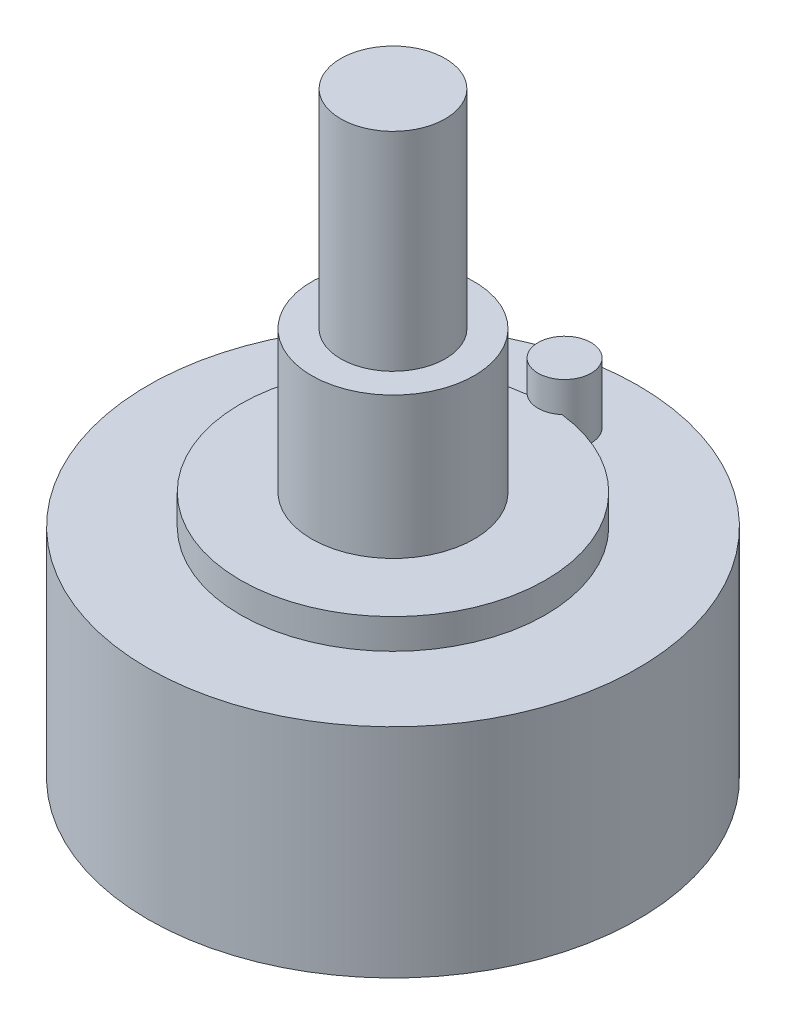
ISO-10303-21;
HEADER;
FILE_DESCRIPTION(('STEP AP214'),'2;1');
FILE_NAME('part.step','',(''),(''),'','','');
FILE_SCHEMA(('AUTOMOTIVE_DESIGN { 1 0 10303 214 1 1 1 1 }'));
ENDSEC;
DATA;
#1=APPLICATION_CONTEXT('core data for automotive mechanical design processes');
#2=APPLICATION_PROTOCOL_DEFINITION('international standard','automotive_design',2000,#1);
#3=PRODUCT_CONTEXT('',#1,'mechanical');
#4=PRODUCT('Part','Part','',(#3));
#5=PRODUCT_RELATED_PRODUCT_CATEGORY('part','',(#4));
#6=PRODUCT_DEFINITION_FORMATION('','',#4);
#7=PRODUCT_DEFINITION_CONTEXT('part definition',#1,'design');
#8=PRODUCT_DEFINITION('design','',#6,#7);
#9=PRODUCT_DEFINITION_SHAPE('','',#8);
#10=(LENGTH_UNIT() NAMED_UNIT(*) SI_UNIT(.MILLI.,.METRE.));
#11=(NAMED_UNIT(*) PLANE_ANGLE_UNIT() SI_UNIT($,.RADIAN.));
#12=(NAMED_UNIT(*) SI_UNIT($,.STERADIAN.) SOLID_ANGLE_UNIT());
#13=UNCERTAINTY_MEASURE_WITH_UNIT(LENGTH_MEASURE(1.E-05),#10,'distance_accuracy_value','');
#14=(GEOMETRIC_REPRESENTATION_CONTEXT(3) GLOBAL_UNCERTAINTY_ASSIGNED_CONTEXT((#13)) GLOBAL_UNIT_ASSIGNED_CONTEXT((#10,
#11,#12)) REPRESENTATION_CONTEXT('',''));
#15=CARTESIAN_POINT('',(0.,0.,0.));
#16=DIRECTION('',(0.,0.,1.));
#17=DIRECTION('',(1.,0.,0.));
#18=AXIS2_PLACEMENT_3D('',#15,#16,#17);
#19=CARTESIAN_POINT('',(0.,14.,0.));
#20=DIRECTION('',(0.,-1.,0.));
#21=DIRECTION('',(0.,0.,-1.));
#22=AXIS2_PLACEMENT_3D('',#19,#20,#21);
#23=CYLINDRICAL_SURFACE('',#22,8.625);
#24=DIRECTION('',(0.,-1.,0.));
#25=VECTOR('',#24,1.);
#26=CARTESIAN_POINT('',(0.984839561783791,14.01,-8.56858891752577));
#27=LINE('',#26,#25);
#28=CARTESIAN_POINT('',(0.984839561783787,14.,-8.56858891752577));
#29=VERTEX_POINT('',#28);
#30=CARTESIAN_POINT('',(0.984839561783797,12.3,-8.56858891752577));
#31=VERTEX_POINT('',#30);
#32=EDGE_CURVE('E57',#29,#31,#27,.T.);
#33=ORIENTED_EDGE('',*,*,#32,.F.);
#34=CARTESIAN_POINT('',(0.,14.,0.));
#35=DIRECTION('',(0.,1.,0.));
#36=DIRECTION('',(0.,0.,1.));
#37=AXIS2_PLACEMENT_3D('',#34,#35,#36);
#38=CIRCLE('',#37,8.625);
#39=CARTESIAN_POINT('',(-0.984839561783787,14.,-8.56858891752577));
#40=VERTEX_POINT('',#39);
#41=EDGE_CURVE('E74',#40,#29,#38,.T.);
#42=ORIENTED_EDGE('',*,*,#41,.F.);
#43=DIRECTION('',(0.,-1.,0.));
#44=VECTOR('',#43,1.);
#45=CARTESIAN_POINT('',(-0.984839561783791,14.01,-8.56858891752577));
#46=LINE('',#45,#44);
#47=CARTESIAN_POINT('',(-0.984839561783797,12.3,-8.56858891752577));
#48=VERTEX_POINT('',#47);
#49=EDGE_CURVE('E50',#48,#40,#46,.F.);
#50=ORIENTED_EDGE('',*,*,#49,.F.);
#51=CARTESIAN_POINT('',(0.,12.3,0.));
#52=DIRECTION('',(0.,1.,0.));
#53=DIRECTION('',(0.,0.,1.));
#54=AXIS2_PLACEMENT_3D('',#51,#52,#53);
#55=CIRCLE('',#54,8.625);
#56=EDGE_CURVE('E71',#48,#31,#55,.T.);
#57=ORIENTED_EDGE('',*,*,#56,.T.);
#58=EDGE_LOOP('',(#33,#42,#50,#57));
#59=FACE_BOUND('',#58,.T.);
#60=ADVANCED_FACE('F35',(#59),#23,.T.);
#61=CARTESIAN_POINT('',(0.,12.3,0.));
#62=DIRECTION('',(0.,-1.,0.));
#63=DIRECTION('',(0.,0.,-1.));
#64=AXIS2_PLACEMENT_3D('',#61,#62,#63);
#65=CYLINDRICAL_SURFACE('',#64,13.85);
#66=CARTESIAN_POINT('',(0.,12.3,0.));
#67=DIRECTION('',(0.,1.,0.));
#68=DIRECTION('',(0.,0.,1.));
#69=AXIS2_PLACEMENT_3D('',#66,#67,#68);
#70=CIRCLE('',#69,13.85);
#71=CARTESIAN_POINT('',(0.,12.3,13.85));
#72=VERTEX_POINT('',#71);
#73=EDGE_CURVE('E43',#72,#72,#70,.T.);
#74=ORIENTED_EDGE('',*,*,#73,.F.);
#75=EDGE_LOOP('',(#74));
#76=FACE_BOUND('',#75,.T.);
#77=CARTESIAN_POINT('',(0.,0.,0.));
#78=DIRECTION('',(0.,1.,0.));
#79=DIRECTION('',(0.,0.,1.));
#80=AXIS2_PLACEMENT_3D('',#77,#78,#79);
#81=CIRCLE('',#80,13.85);
#82=CARTESIAN_POINT('',(0.,0.,13.85));
#83=VERTEX_POINT('',#82);
#84=EDGE_CURVE('E77',#83,#83,#81,.T.);
#85=ORIENTED_EDGE('',*,*,#84,.T.);
#86=EDGE_LOOP('',(#85));
#87=FACE_BOUND('',#86,.T.);
#88=ADVANCED_FACE('F37',(#76,#87),#65,.T.);
#89=CARTESIAN_POINT('',(0.,12.3,0.));
#90=DIRECTION('',(0.,1.,0.));
#91=DIRECTION('',(0.,0.,1.));
#92=AXIS2_PLACEMENT_3D('',#89,#90,#91);
#93=PLANE('',#92);
#94=ORIENTED_EDGE('',*,*,#56,.F.);
#95=CARTESIAN_POINT('',(0.,12.3,-9.7));
#96=DIRECTION('',(0.,1.,0.));
#97=DIRECTION('',(0.,0.,1.));
#98=AXIS2_PLACEMENT_3D('',#95,#96,#97);
#99=CIRCLE('',#98,1.5);
#100=EDGE_CURVE('E60',#31,#48,#99,.T.);
#101=ORIENTED_EDGE('',*,*,#100,.F.);
#102=EDGE_LOOP('',(#94,#101));
#103=FACE_BOUND('',#102,.T.);
#104=ORIENTED_EDGE('',*,*,#73,.T.);
#105=EDGE_LOOP('',(#104));
#106=FACE_BOUND('',#105,.T.);
#107=ADVANCED_FACE('F69',(#103,#106),#93,.T.);
#108=CARTESIAN_POINT('',(0.,0.,0.));
#109=DIRECTION('',(0.,1.,0.));
#110=DIRECTION('',(0.,0.,1.));
#111=AXIS2_PLACEMENT_3D('',#108,#109,#110);
#112=PLANE('',#111);
#113=ORIENTED_EDGE('',*,*,#84,.F.);
#114=EDGE_LOOP('',(#113));
#115=FACE_BOUND('',#114,.T.);
#116=ADVANCED_FACE('F89',(#115),#112,.F.);
#117=CARTESIAN_POINT('',(0.,14.,0.));
#118=DIRECTION('',(0.,1.,0.));
#119=DIRECTION('',(0.,0.,1.));
#120=AXIS2_PLACEMENT_3D('',#117,#118,#119);
#121=PLANE('',#120);
#122=CARTESIAN_POINT('',(0.,14.,0.));
#123=DIRECTION('',(0.,1.,0.));
#124=DIRECTION('',(0.,0.,1.));
#125=AXIS2_PLACEMENT_3D('',#122,#123,#124);
#126=CIRCLE('',#125,4.6);
#127=CARTESIAN_POINT('',(0.,14.,4.6));
#128=VERTEX_POINT('',#127);
#129=EDGE_CURVE('E80',#128,#128,#126,.T.);
#130=ORIENTED_EDGE('',*,*,#129,.F.);
#131=EDGE_LOOP('',(#130));
#132=FACE_BOUND('',#131,.T.);
#133=ORIENTED_EDGE('',*,*,#41,.T.);
#134=CARTESIAN_POINT('',(0.,14.,-9.7));
#135=DIRECTION('',(0.,1.,0.));
#136=DIRECTION('',(0.,0.,1.));
#137=AXIS2_PLACEMENT_3D('',#134,#135,#136);
#138=CIRCLE('',#137,1.5);
#139=EDGE_CURVE('E11',#29,#40,#138,.F.);
#140=ORIENTED_EDGE('',*,*,#139,.T.);
#141=EDGE_LOOP('',(#133,#140));
#142=FACE_BOUND('',#141,.T.);
#143=ADVANCED_FACE('F91',(#132,#142),#121,.T.);
#144=CARTESIAN_POINT('',(0.,22.,0.));
#145=DIRECTION('',(0.,-1.,0.));
#146=DIRECTION('',(0.,0.,-1.));
#147=AXIS2_PLACEMENT_3D('',#144,#145,#146);
#148=CYLINDRICAL_SURFACE('',#147,4.6);
#149=CARTESIAN_POINT('',(0.,22.,0.));
#150=DIRECTION('',(0.,1.,0.));
#151=DIRECTION('',(0.,0.,1.));
#152=AXIS2_PLACEMENT_3D('',#149,#150,#151);
#153=CIRCLE('',#152,4.6);
#154=CARTESIAN_POINT('',(0.,22.,4.6));
#155=VERTEX_POINT('',#154);
#156=EDGE_CURVE('E75',#155,#155,#153,.T.);
#157=ORIENTED_EDGE('',*,*,#156,.F.);
#158=EDGE_LOOP('',(#157));
#159=FACE_BOUND('',#158,.T.);
#160=ORIENTED_EDGE('',*,*,#129,.T.);
#161=EDGE_LOOP('',(#160));
#162=FACE_BOUND('',#161,.T.);
#163=ADVANCED_FACE('F96',(#159,#162),#148,.T.);
#164=CARTESIAN_POINT('',(0.,22.,0.));
#165=DIRECTION('',(0.,1.,0.));
#166=DIRECTION('',(0.,0.,1.));
#167=AXIS2_PLACEMENT_3D('',#164,#165,#166);
#168=PLANE('',#167);
#169=CARTESIAN_POINT('',(0.,22.,0.));
#170=DIRECTION('',(0.,1.,0.));
#171=DIRECTION('',(0.,0.,1.));
#172=AXIS2_PLACEMENT_3D('',#169,#170,#171);
#173=CIRCLE('',#172,2.955);
#174=CARTESIAN_POINT('',(0.,22.,2.955));
#175=VERTEX_POINT('',#174);
#176=EDGE_CURVE('E65',#175,#175,#173,.T.);
#177=ORIENTED_EDGE('',*,*,#176,.F.);
#178=EDGE_LOOP('',(#177));
#179=FACE_BOUND('',#178,.T.);
#180=ORIENTED_EDGE('',*,*,#156,.T.);
#181=EDGE_LOOP('',(#180));
#182=FACE_BOUND('',#181,.T.);
#183=ADVANCED_FACE('F109',(#179,#182),#168,.T.);
#184=CARTESIAN_POINT('',(0.,33.75,0.));
#185=DIRECTION('',(0.,-1.,0.));
#186=DIRECTION('',(0.,0.,-1.));
#187=AXIS2_PLACEMENT_3D('',#184,#185,#186);
#188=CYLINDRICAL_SURFACE('',#187,2.955);
#189=CARTESIAN_POINT('',(0.,33.75,0.));
#190=DIRECTION('',(0.,1.,0.));
#191=DIRECTION('',(0.,0.,1.));
#192=AXIS2_PLACEMENT_3D('',#189,#190,#191);
#193=CIRCLE('',#192,2.955);
#194=CARTESIAN_POINT('',(0.,33.75,2.955));
#195=VERTEX_POINT('',#194);
#196=EDGE_CURVE('E135',#195,#195,#193,.T.);
#197=ORIENTED_EDGE('',*,*,#196,.F.);
#198=EDGE_LOOP('',(#197));
#199=FACE_BOUND('',#198,.T.);
#200=ORIENTED_EDGE('',*,*,#176,.T.);
#201=EDGE_LOOP('',(#200));
#202=FACE_BOUND('',#201,.T.);
#203=ADVANCED_FACE('F113',(#199,#202),#188,.T.);
#204=CARTESIAN_POINT('',(0.,33.75,0.));
#205=DIRECTION('',(0.,1.,0.));
#206=DIRECTION('',(0.,0.,1.));
#207=AXIS2_PLACEMENT_3D('',#204,#205,#206);
#208=PLANE('',#207);
#209=ORIENTED_EDGE('',*,*,#196,.T.);
#210=EDGE_LOOP('',(#209));
#211=FACE_BOUND('',#210,.T.);
#212=ADVANCED_FACE('F117',(#211),#208,.T.);
#213=CARTESIAN_POINT('',(0.,15.72,-9.7));
#214=DIRECTION('',(0.,-1.,0.));
#215=DIRECTION('',(0.,0.,-1.));
#216=AXIS2_PLACEMENT_3D('',#213,#214,#215);
#217=CYLINDRICAL_SURFACE('',#216,1.5);
#218=CARTESIAN_POINT('',(0.,15.72,-9.7));
#219=DIRECTION('',(0.,1.,0.));
#220=DIRECTION('',(0.,0.,1.));
#221=AXIS2_PLACEMENT_3D('',#218,#219,#220);
#222=CIRCLE('',#221,1.5);
#223=CARTESIAN_POINT('',(0.,15.72,-8.2));
#224=VERTEX_POINT('',#223);
#225=EDGE_CURVE('E72',#224,#224,#222,.T.);
#226=ORIENTED_EDGE('',*,*,#225,.F.);
#227=EDGE_LOOP('',(#226));
#228=FACE_BOUND('',#227,.T.);
#229=ORIENTED_EDGE('',*,*,#139,.F.);
#230=ORIENTED_EDGE('',*,*,#32,.T.);
#231=ORIENTED_EDGE('',*,*,#100,.T.);
#232=ORIENTED_EDGE('',*,*,#49,.T.);
#233=EDGE_LOOP('',(#229,#230,#231,#232));
#234=FACE_BOUND('',#233,.T.);
#235=ADVANCED_FACE('F59',(#228,#234),#217,.T.);
#236=CARTESIAN_POINT('',(0.,15.72,-9.7));
#237=DIRECTION('',(0.,1.,0.));
#238=DIRECTION('',(0.,0.,1.));
#239=AXIS2_PLACEMENT_3D('',#236,#237,#238);
#240=PLANE('',#239);
#241=ORIENTED_EDGE('',*,*,#225,.T.);
#242=EDGE_LOOP('',(#241));
#243=FACE_BOUND('',#242,.T.);
#244=ADVANCED_FACE('F124',(#243),#240,.T.);
#245=CLOSED_SHELL('',(#60,#88,#107,#116,#143,#163,#183,#203,#212,#235,#244));
#246=MANIFOLD_SOLID_BREP('B2',#245);
#247=ADVANCED_BREP_SHAPE_REPRESENTATION('',(#18,#246),#14);
#248=SHAPE_DEFINITION_REPRESENTATION(#9,#247);
ENDSEC;
END-ISO-10303-21;
